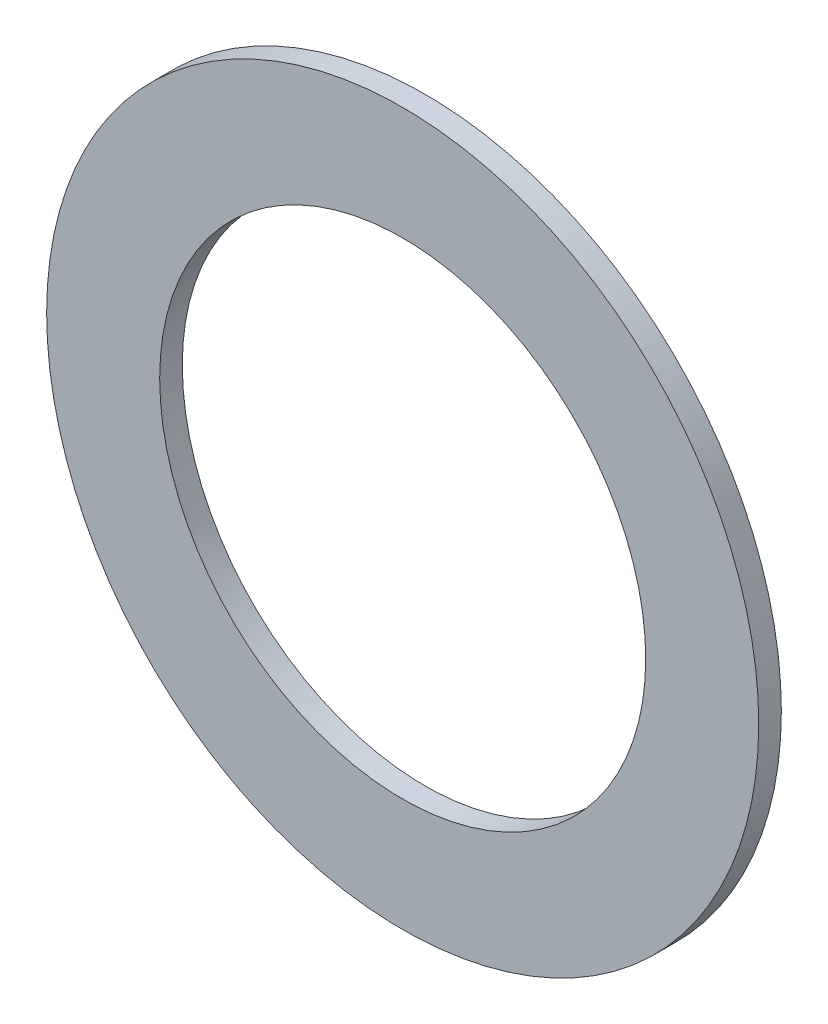
ISO-10303-21;
HEADER;
FILE_DESCRIPTION(('STEP AP214'),'2;1');
FILE_NAME('part.step','',(''),(''),'','','');
FILE_SCHEMA(('AUTOMOTIVE_DESIGN { 1 0 10303 214 1 1 1 1 }'));
ENDSEC;
DATA;
#1=APPLICATION_CONTEXT('core data for automotive mechanical design processes');
#2=APPLICATION_PROTOCOL_DEFINITION('international standard','automotive_design',2000,#1);
#3=PRODUCT_CONTEXT('',#1,'mechanical');
#4=PRODUCT('Part','Part','',(#3));
#5=PRODUCT_RELATED_PRODUCT_CATEGORY('part','',(#4));
#6=PRODUCT_DEFINITION_FORMATION('','',#4);
#7=PRODUCT_DEFINITION_CONTEXT('part definition',#1,'design');
#8=PRODUCT_DEFINITION('design','',#6,#7);
#9=PRODUCT_DEFINITION_SHAPE('','',#8);
#10=(LENGTH_UNIT() NAMED_UNIT(*) SI_UNIT(.MILLI.,.METRE.));
#11=(NAMED_UNIT(*) PLANE_ANGLE_UNIT() SI_UNIT($,.RADIAN.));
#12=(NAMED_UNIT(*) SI_UNIT($,.STERADIAN.) SOLID_ANGLE_UNIT());
#13=UNCERTAINTY_MEASURE_WITH_UNIT(LENGTH_MEASURE(1.E-05),#10,'distance_accuracy_value','');
#14=(GEOMETRIC_REPRESENTATION_CONTEXT(3) GLOBAL_UNCERTAINTY_ASSIGNED_CONTEXT((#13)) GLOBAL_UNIT_ASSIGNED_CONTEXT((#10,
#11,#12)) REPRESENTATION_CONTEXT('',''));
#15=CARTESIAN_POINT('',(0.,0.,0.));
#16=DIRECTION('',(0.,0.,1.));
#17=DIRECTION('',(1.,0.,0.));
#18=AXIS2_PLACEMENT_3D('',#15,#16,#17);
#19=CARTESIAN_POINT('',(0.,0.,1.));
#20=DIRECTION('',(0.,0.,1.));
#21=DIRECTION('',(1.,0.,0.));
#22=AXIS2_PLACEMENT_3D('',#19,#20,#21);
#23=PLANE('',#22);
#24=CARTESIAN_POINT('',(0.,0.,1.));
#25=DIRECTION('',(0.,0.,1.));
#26=DIRECTION('',(1.,0.,0.));
#27=AXIS2_PLACEMENT_3D('',#24,#25,#26);
#28=CIRCLE('',#27,15.75);
#29=CARTESIAN_POINT('',(15.75,0.,1.));
#30=VERTEX_POINT('',#29);
#31=EDGE_CURVE('E10',#30,#30,#28,.T.);
#32=ORIENTED_EDGE('',*,*,#31,.T.);
#33=EDGE_LOOP('',(#32));
#34=FACE_BOUND('',#33,.T.);
#35=CARTESIAN_POINT('',(0.,0.,1.));
#36=DIRECTION('',(0.,0.,1.));
#37=DIRECTION('',(1.,0.,0.));
#38=AXIS2_PLACEMENT_3D('',#35,#36,#37);
#39=CIRCLE('',#38,10.75);
#40=CARTESIAN_POINT('',(10.75,0.,1.));
#41=VERTEX_POINT('',#40);
#42=EDGE_CURVE('E45',#41,#41,#39,.T.);
#43=ORIENTED_EDGE('',*,*,#42,.F.);
#44=EDGE_LOOP('',(#43));
#45=FACE_BOUND('',#44,.T.);
#46=ADVANCED_FACE('F34',(#34,#45),#23,.T.);
#47=CARTESIAN_POINT('',(0.,0.,0.));
#48=DIRECTION('',(0.,0.,1.));
#49=DIRECTION('',(1.,0.,0.));
#50=AXIS2_PLACEMENT_3D('',#47,#48,#49);
#51=PLANE('',#50);
#52=CARTESIAN_POINT('',(0.,0.,0.));
#53=DIRECTION('',(0.,0.,1.));
#54=DIRECTION('',(1.,0.,0.));
#55=AXIS2_PLACEMENT_3D('',#52,#53,#54);
#56=CIRCLE('',#55,15.75);
#57=CARTESIAN_POINT('',(15.75,0.,0.));
#58=VERTEX_POINT('',#57);
#59=EDGE_CURVE('E38',#58,#58,#56,.T.);
#60=ORIENTED_EDGE('',*,*,#59,.F.);
#61=EDGE_LOOP('',(#60));
#62=FACE_BOUND('',#61,.T.);
#63=CARTESIAN_POINT('',(0.,0.,0.));
#64=DIRECTION('',(0.,0.,1.));
#65=DIRECTION('',(1.,0.,0.));
#66=AXIS2_PLACEMENT_3D('',#63,#64,#65);
#67=CIRCLE('',#66,10.75);
#68=CARTESIAN_POINT('',(10.75,0.,0.));
#69=VERTEX_POINT('',#68);
#70=EDGE_CURVE('E47',#69,#69,#67,.T.);
#71=ORIENTED_EDGE('',*,*,#70,.T.);
#72=EDGE_LOOP('',(#71));
#73=FACE_BOUND('',#72,.T.);
#74=ADVANCED_FACE('F57',(#62,#73),#51,.F.);
#75=CARTESIAN_POINT('',(0.,0.,1.));
#76=DIRECTION('',(0.,0.,-1.));
#77=DIRECTION('',(-1.,0.,0.));
#78=AXIS2_PLACEMENT_3D('',#75,#76,#77);
#79=CYLINDRICAL_SURFACE('',#78,15.75);
#80=ORIENTED_EDGE('',*,*,#31,.F.);
#81=EDGE_LOOP('',(#80));
#82=FACE_BOUND('',#81,.T.);
#83=ORIENTED_EDGE('',*,*,#59,.T.);
#84=EDGE_LOOP('',(#83));
#85=FACE_BOUND('',#84,.T.);
#86=ADVANCED_FACE('F36',(#82,#85),#79,.T.);
#87=CARTESIAN_POINT('',(0.,0.,1.));
#88=DIRECTION('',(0.,0.,-1.));
#89=DIRECTION('',(-1.,0.,0.));
#90=AXIS2_PLACEMENT_3D('',#87,#88,#89);
#91=CYLINDRICAL_SURFACE('',#90,10.75);
#92=ORIENTED_EDGE('',*,*,#42,.T.);
#93=EDGE_LOOP('',(#92));
#94=FACE_BOUND('',#93,.T.);
#95=ORIENTED_EDGE('',*,*,#70,.F.);
#96=EDGE_LOOP('',(#95));
#97=FACE_BOUND('',#96,.T.);
#98=ADVANCED_FACE('F53',(#94,#97),#91,.F.);
#99=CLOSED_SHELL('',(#46,#74,#86,#98));
#100=MANIFOLD_SOLID_BREP('B2',#99);
#101=ADVANCED_BREP_SHAPE_REPRESENTATION('',(#18,#100),#14);
#102=SHAPE_DEFINITION_REPRESENTATION(#9,#101);
ENDSEC;
END-ISO-10303-21;
